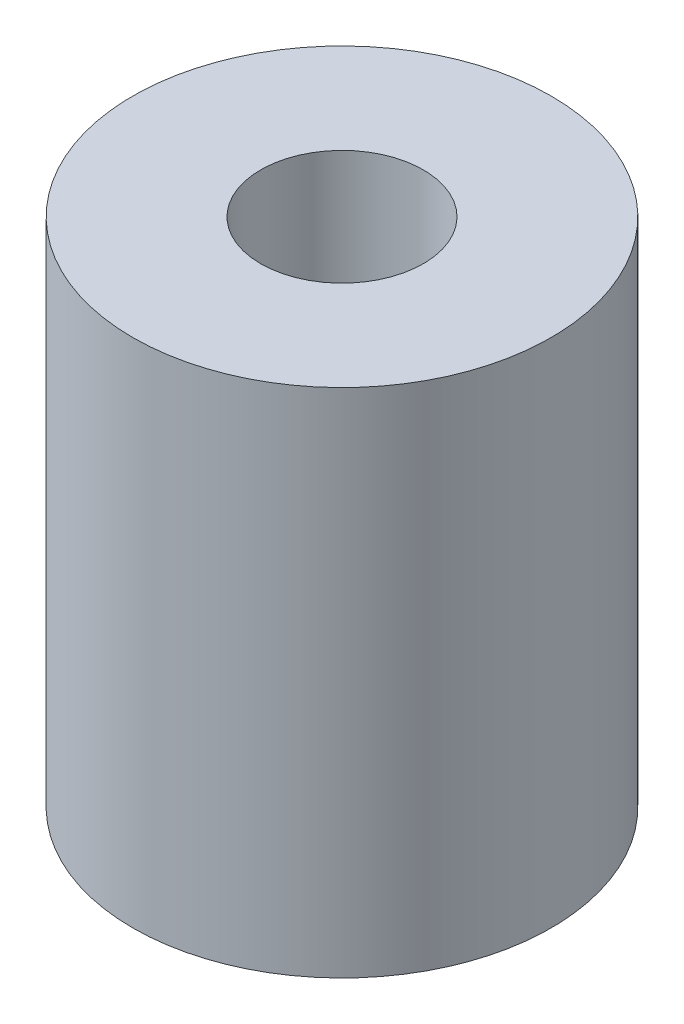
ISO-10303-21;
HEADER;
FILE_DESCRIPTION(('STEP AP214'),'2;1');
FILE_NAME('part.step','',(''),(''),'','','');
FILE_SCHEMA(('AUTOMOTIVE_DESIGN { 1 0 10303 214 1 1 1 1 }'));
ENDSEC;
DATA;
#1=APPLICATION_CONTEXT('core data for automotive mechanical design processes');
#2=APPLICATION_PROTOCOL_DEFINITION('international standard','automotive_design',2000,#1);
#3=PRODUCT_CONTEXT('',#1,'mechanical');
#4=PRODUCT('Part','Part','',(#3));
#5=PRODUCT_RELATED_PRODUCT_CATEGORY('part','',(#4));
#6=PRODUCT_DEFINITION_FORMATION('','',#4);
#7=PRODUCT_DEFINITION_CONTEXT('part definition',#1,'design');
#8=PRODUCT_DEFINITION('design','',#6,#7);
#9=PRODUCT_DEFINITION_SHAPE('','',#8);
#10=(LENGTH_UNIT() NAMED_UNIT(*) SI_UNIT(.MILLI.,.METRE.));
#11=(NAMED_UNIT(*) PLANE_ANGLE_UNIT() SI_UNIT($,.RADIAN.));
#12=(NAMED_UNIT(*) SI_UNIT($,.STERADIAN.) SOLID_ANGLE_UNIT());
#13=UNCERTAINTY_MEASURE_WITH_UNIT(LENGTH_MEASURE(1.E-05),#10,'distance_accuracy_value','');
#14=(GEOMETRIC_REPRESENTATION_CONTEXT(3) GLOBAL_UNCERTAINTY_ASSIGNED_CONTEXT((#13)) GLOBAL_UNIT_ASSIGNED_CONTEXT((#10,
#11,#12)) REPRESENTATION_CONTEXT('',''));
#15=CARTESIAN_POINT('',(0.,0.,0.));
#16=DIRECTION('',(0.,0.,1.));
#17=DIRECTION('',(1.,0.,0.));
#18=AXIS2_PLACEMENT_3D('',#15,#16,#17);
#19=CARTESIAN_POINT('',(0.,11.,0.));
#20=DIRECTION('',(0.,1.,0.));
#21=DIRECTION('',(0.,0.,1.));
#22=AXIS2_PLACEMENT_3D('',#19,#20,#21);
#23=PLANE('',#22);
#24=CARTESIAN_POINT('',(0.,11.,0.));
#25=DIRECTION('',(0.,1.,0.));
#26=DIRECTION('',(0.,0.,1.));
#27=AXIS2_PLACEMENT_3D('',#24,#25,#26);
#28=CIRCLE('',#27,4.5);
#29=CARTESIAN_POINT('',(0.,11.,4.5));
#30=VERTEX_POINT('',#29);
#31=EDGE_CURVE('E10',#30,#30,#28,.T.);
#32=ORIENTED_EDGE('',*,*,#31,.T.);
#33=EDGE_LOOP('',(#32));
#34=FACE_BOUND('',#33,.T.);
#35=CARTESIAN_POINT('',(0.,11.,0.));
#36=DIRECTION('',(0.,1.,0.));
#37=DIRECTION('',(0.,0.,1.));
#38=AXIS2_PLACEMENT_3D('',#35,#36,#37);
#39=CIRCLE('',#38,1.75);
#40=CARTESIAN_POINT('',(0.,11.,1.75));
#41=VERTEX_POINT('',#40);
#42=EDGE_CURVE('E42',#41,#41,#39,.T.);
#43=ORIENTED_EDGE('',*,*,#42,.F.);
#44=EDGE_LOOP('',(#43));
#45=FACE_BOUND('',#44,.T.);
#46=ADVANCED_FACE('F31',(#34,#45),#23,.T.);
#47=CARTESIAN_POINT('',(0.,0.,0.));
#48=DIRECTION('',(0.,1.,0.));
#49=DIRECTION('',(0.,0.,1.));
#50=AXIS2_PLACEMENT_3D('',#47,#48,#49);
#51=PLANE('',#50);
#52=CARTESIAN_POINT('',(0.,0.,0.));
#53=DIRECTION('',(0.,1.,0.));
#54=DIRECTION('',(0.,0.,1.));
#55=AXIS2_PLACEMENT_3D('',#52,#53,#54);
#56=CIRCLE('',#55,4.5);
#57=CARTESIAN_POINT('',(0.,0.,4.5));
#58=VERTEX_POINT('',#57);
#59=EDGE_CURVE('E35',#58,#58,#56,.T.);
#60=ORIENTED_EDGE('',*,*,#59,.F.);
#61=EDGE_LOOP('',(#60));
#62=FACE_BOUND('',#61,.T.);
#63=CARTESIAN_POINT('',(0.,0.,0.));
#64=DIRECTION('',(0.,1.,0.));
#65=DIRECTION('',(0.,0.,1.));
#66=AXIS2_PLACEMENT_3D('',#63,#64,#65);
#67=CIRCLE('',#66,1.75);
#68=CARTESIAN_POINT('',(0.,0.,1.75));
#69=VERTEX_POINT('',#68);
#70=EDGE_CURVE('E44',#69,#69,#67,.T.);
#71=ORIENTED_EDGE('',*,*,#70,.T.);
#72=EDGE_LOOP('',(#71));
#73=FACE_BOUND('',#72,.T.);
#74=ADVANCED_FACE('F54',(#62,#73),#51,.F.);
#75=CARTESIAN_POINT('',(0.,11.,0.));
#76=DIRECTION('',(0.,-1.,0.));
#77=DIRECTION('',(0.,0.,-1.));
#78=AXIS2_PLACEMENT_3D('',#75,#76,#77);
#79=CYLINDRICAL_SURFACE('',#78,4.5);
#80=ORIENTED_EDGE('',*,*,#31,.F.);
#81=EDGE_LOOP('',(#80));
#82=FACE_BOUND('',#81,.T.);
#83=ORIENTED_EDGE('',*,*,#59,.T.);
#84=EDGE_LOOP('',(#83));
#85=FACE_BOUND('',#84,.T.);
#86=ADVANCED_FACE('F33',(#82,#85),#79,.T.);
#87=CARTESIAN_POINT('',(0.,11.,0.));
#88=DIRECTION('',(0.,-1.,0.));
#89=DIRECTION('',(0.,0.,-1.));
#90=AXIS2_PLACEMENT_3D('',#87,#88,#89);
#91=CYLINDRICAL_SURFACE('',#90,1.75);
#92=ORIENTED_EDGE('',*,*,#42,.T.);
#93=EDGE_LOOP('',(#92));
#94=FACE_BOUND('',#93,.T.);
#95=ORIENTED_EDGE('',*,*,#70,.F.);
#96=EDGE_LOOP('',(#95));
#97=FACE_BOUND('',#96,.T.);
#98=ADVANCED_FACE('F50',(#94,#97),#91,.F.);
#99=CLOSED_SHELL('',(#46,#74,#86,#98));
#100=MANIFOLD_SOLID_BREP('B2',#99);
#101=ADVANCED_BREP_SHAPE_REPRESENTATION('',(#18,#100),#14);
#102=SHAPE_DEFINITION_REPRESENTATION(#9,#101);
ENDSEC;
END-ISO-10303-21;
